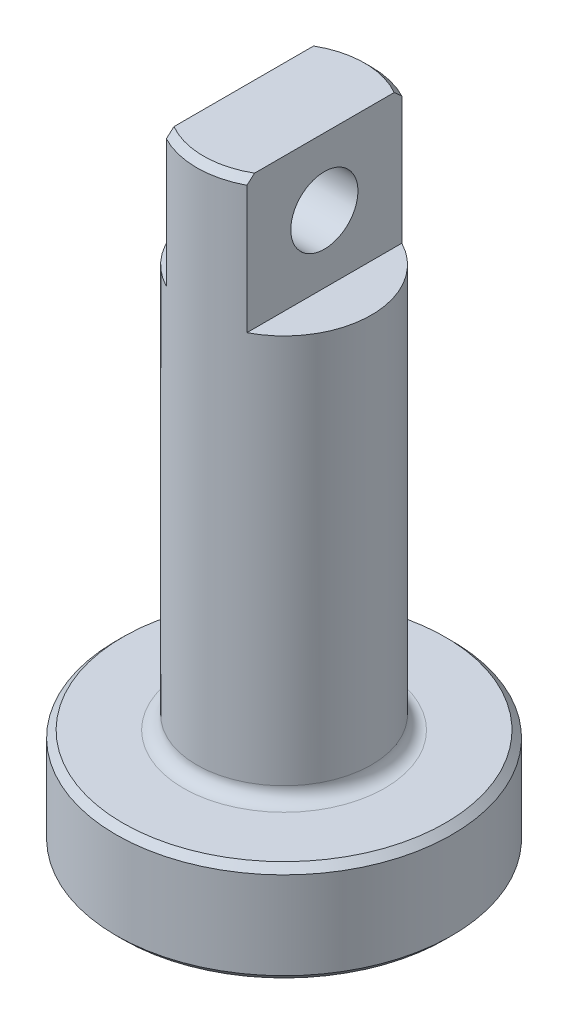
ISO-10303-21;
HEADER;
FILE_DESCRIPTION(('STEP AP214'),'2;1');
FILE_NAME('part.step','',(''),(''),'','','');
FILE_SCHEMA(('AUTOMOTIVE_DESIGN { 1 0 10303 214 1 1 1 1 }'));
ENDSEC;
DATA;
#1=APPLICATION_CONTEXT('core data for automotive mechanical design processes');
#2=APPLICATION_PROTOCOL_DEFINITION('international standard','automotive_design',2000,#1);
#3=PRODUCT_CONTEXT('',#1,'mechanical');
#4=PRODUCT('Part','Part','',(#3));
#5=PRODUCT_RELATED_PRODUCT_CATEGORY('part','',(#4));
#6=PRODUCT_DEFINITION_FORMATION('','',#4);
#7=PRODUCT_DEFINITION_CONTEXT('part definition',#1,'design');
#8=PRODUCT_DEFINITION('design','',#6,#7);
#9=PRODUCT_DEFINITION_SHAPE('','',#8);
#10=(LENGTH_UNIT() NAMED_UNIT(*) SI_UNIT(.MILLI.,.METRE.));
#11=(NAMED_UNIT(*) PLANE_ANGLE_UNIT() SI_UNIT($,.RADIAN.));
#12=(NAMED_UNIT(*) SI_UNIT($,.STERADIAN.) SOLID_ANGLE_UNIT());
#13=UNCERTAINTY_MEASURE_WITH_UNIT(LENGTH_MEASURE(1.E-05),#10,'distance_accuracy_value','');
#14=(GEOMETRIC_REPRESENTATION_CONTEXT(3) GLOBAL_UNCERTAINTY_ASSIGNED_CONTEXT((#13)) GLOBAL_UNIT_ASSIGNED_CONTEXT((#10,
#11,#12)) REPRESENTATION_CONTEXT('',''));
#15=CARTESIAN_POINT('',(0.,0.,0.));
#16=DIRECTION('',(0.,0.,1.));
#17=DIRECTION('',(1.,0.,0.));
#18=AXIS2_PLACEMENT_3D('',#15,#16,#17);
#19=CARTESIAN_POINT('',(0.,95.,0.));
#20=DIRECTION('',(0.,-1.,0.));
#21=DIRECTION('',(0.,0.,-1.));
#22=AXIS2_PLACEMENT_3D('',#19,#20,#21);
#23=CONICAL_SURFACE('',#22,12.,0.785398163397443);
#24=CARTESIAN_POINT('',(-6.,79.9275470546993,26.3991990120062));
#25=CARTESIAN_POINT('',(-6.,80.6341642450559,25.6744988883897));
#26=CARTESIAN_POINT('',(-6.,81.3401092025552,24.9491402545293));
#27=CARTESIAN_POINT('',(-6.,82.7501344284375,23.496538406795));
#28=CARTESIAN_POINT('',(-6.,83.4542145956639,22.7692950947542));
#29=CARTESIAN_POINT('',(-6.,84.8614487395655,21.3108434702345));
#30=CARTESIAN_POINT('',(-6.,85.5645973409479,20.5796299681985));
#31=CARTESIAN_POINT('',(-6.,86.9675119394741,19.1140214225354));
#32=CARTESIAN_POINT('',(-6.,87.6672780823759,18.3796265186355));
#33=CARTESIAN_POINT('',(-6.,88.730253828766,17.2568520242311));
#34=CARTESIAN_POINT('',(-6.,89.0951785539853,16.8700963866775));
#35=CARTESIAN_POINT('',(-6.,89.8234368655577,16.0950904637233));
#36=CARTESIAN_POINT('',(-6.,90.186770455018,15.7068401812442));
#37=CARTESIAN_POINT('',(-6.,90.9115326321244,14.9284606953896));
#38=CARTESIAN_POINT('',(-6.,91.2729609400681,14.5383312313932));
#39=CARTESIAN_POINT('',(-6.,91.9933640619721,13.755816200192));
#40=CARTESIAN_POINT('',(-6.,92.3523388916992,13.3634306475153));
#41=CARTESIAN_POINT('',(-6.,93.0667694779259,12.5762564427714));
#42=CARTESIAN_POINT('',(-6.,93.4222286899368,12.1814709315466));
#43=CARTESIAN_POINT('',(-6.,94.1290810155683,11.388281258454));
#44=CARTESIAN_POINT('',(-6.,94.4804741831645,10.989877144748));
#45=CARTESIAN_POINT('',(-6.,95.1777740838798,10.188434340361));
#46=CARTESIAN_POINT('',(-6.,95.5236820342044,9.78539671312347));
#47=CARTESIAN_POINT('',(-6.,96.0369142189372,9.17611739646055));
#48=CARTESIAN_POINT('',(-6.,96.2070487906753,8.9722427322967));
#49=CARTESIAN_POINT('',(-6.,96.5450749310579,8.56264381811767));
#50=CARTESIAN_POINT('',(-6.,96.7129665311361,8.35691959409061));
#51=CARTESIAN_POINT('',(-6.,97.017598282954,7.97863814383269));
#52=CARTESIAN_POINT('',(-6.,97.1547594096519,7.80642013487587));
#53=CARTESIAN_POINT('',(-6.,97.4269059876114,7.460266432646));
#54=CARTESIAN_POINT('',(-6.,97.5618914025965,7.28633071081072));
#55=CARTESIAN_POINT('',(-6.,97.8293349857229,6.93641358608451));
#56=CARTESIAN_POINT('',(-6.,97.9617921210289,6.7604313925058));
#57=CARTESIAN_POINT('',(-6.,98.2236159497381,6.40618114096575));
#58=CARTESIAN_POINT('',(-6.,98.3529826773984,6.22791310837669));
#59=CARTESIAN_POINT('',(-6.,98.607557873833,5.86932535562481));
#60=CARTESIAN_POINT('',(-6.,98.7327788497951,5.68901453769259));
#61=CARTESIAN_POINT('',(-6.,98.9786988744435,5.32533782315688));
#62=CARTESIAN_POINT('',(-6.,99.0993981427097,5.14197207553109));
#63=CARTESIAN_POINT('',(-6.,99.3351744212622,4.77178257472588));
#64=CARTESIAN_POINT('',(-6.,99.4502543733339,4.58496070306697));
#65=CARTESIAN_POINT('',(-6.,99.6734936513251,4.20724452857542));
#66=CARTESIAN_POINT('',(-6.,99.7816540978106,4.01635089184748));
#67=CARTESIAN_POINT('',(-6.,99.9867346088436,3.63471286364854));
#68=CARTESIAN_POINT('',(-6.,100.083867954794,3.44408384376266));
#69=CARTESIAN_POINT('',(-6.,100.267857618415,3.0578693113396));
#70=CARTESIAN_POINT('',(-6.,100.354713302449,2.86228349410867));
#71=CARTESIAN_POINT('',(-6.,100.515418397594,2.4662661930644));
#72=CARTESIAN_POINT('',(-6.,100.589294994322,2.26584586230924));
#73=CARTESIAN_POINT('',(-6.,100.721286108256,1.85984825952783));
#74=CARTESIAN_POINT('',(-6.,100.77940482658,1.6542723779924));
#75=CARTESIAN_POINT('',(-6.,100.868455839644,1.27430186961261));
#76=CARTESIAN_POINT('',(-6.,100.902340693707,1.10060334302168));
#77=CARTESIAN_POINT('',(-6.,100.95564966851,0.750990039261594));
#78=CARTESIAN_POINT('',(-6.,100.975075907761,0.575075590617254));
#79=CARTESIAN_POINT('',(-6.,100.998449404278,0.222479157799282));
#80=CARTESIAN_POINT('',(-6.,101.002420460355,0.0457987734447481));
#81=CARTESIAN_POINT('',(-6.,100.994732235978,-0.307224471346836));
#82=CARTESIAN_POINT('',(-6.,100.983072270821,-0.483567316659432));
#83=CARTESIAN_POINT('',(-6.,100.944833883917,-0.833797575107952));
#84=CARTESIAN_POINT('',(-6.,100.918322981786,-1.00769247542408));
#85=CARTESIAN_POINT('',(-6.,100.851703997765,-1.35286680042485));
#86=CARTESIAN_POINT('',(-6.,100.81159253599,-1.52414556390357));
#87=CARTESIAN_POINT('',(-6.,100.719306074664,-1.86384642655355));
#88=CARTESIAN_POINT('',(-6.,100.667101067279,-2.03226028235725));
#89=CARTESIAN_POINT('',(-6.,100.552431435734,-2.36550613445244));
#90=CARTESIAN_POINT('',(-6.,100.489967464961,-2.5303383580992));
#91=CARTESIAN_POINT('',(-6.,100.323908681208,-2.93584381032676));
#92=CARTESIAN_POINT('',(-6.,100.215094005153,-3.17437424992507));
#93=CARTESIAN_POINT('',(-6.,99.9829345223585,-3.64430718878424));
#94=CARTESIAN_POINT('',(-6.,99.8595811245706,-3.87570537063528));
#95=CARTESIAN_POINT('',(-6.,99.6015545052451,-4.3327401148906));
#96=CARTESIAN_POINT('',(-6.,99.4668564575361,-4.55836255417597));
#97=CARTESIAN_POINT('',(-6.,99.1889875522021,-5.0042272134799));
#98=CARTESIAN_POINT('',(-6.,99.0458183977673,-5.22447050252756));
#99=CARTESIAN_POINT('',(-6.,98.7507115853472,-5.66370867918485));
#100=CARTESIAN_POINT('',(-6.,98.5986757951483,-5.8826373298122));
#101=CARTESIAN_POINT('',(-6.,98.2892471146105,-6.31667340263283));
#102=CARTESIAN_POINT('',(-6.,98.1318540176332,-6.53178067694256));
#103=CARTESIAN_POINT('',(-6.,97.8130186542161,-6.95849815270591));
#104=CARTESIAN_POINT('',(-6.,97.6515823239706,-7.17011280190461));
#105=CARTESIAN_POINT('',(-6.,97.3252672053643,-7.59065458481818));
#106=CARTESIAN_POINT('',(-6.,97.1603885240668,-7.7995818017913));
#107=CARTESIAN_POINT('',(-6.,96.8222180631181,-8.22215520873711));
#108=CARTESIAN_POINT('',(-6.,96.6488297591678,-8.43572403551774));
#109=CARTESIAN_POINT('',(-6.,96.2995604201917,-8.86081538830492));
#110=CARTESIAN_POINT('',(-6.,96.1236793475583,-9.07233788335791));
#111=CARTESIAN_POINT('',(-6.,95.5929179537855,-9.70433234633449));
#112=CARTESIAN_POINT('',(-6.,95.2349414664821,-10.1222040167637));
#113=CARTESIAN_POINT('',(-6.,94.5130229138458,-10.9529289983091));
#114=CARTESIAN_POINT('',(-6.,94.1490793262811,-11.365780980588));
#115=CARTESIAN_POINT('',(-6.,93.4168217156854,-12.1875964360031));
#116=CARTESIAN_POINT('',(-6.,93.0485076280156,-12.5965598514667));
#117=CARTESIAN_POINT('',(-6.,92.3079835719101,-13.41210401886));
#118=CARTESIAN_POINT('',(-6.,91.9357684225031,-13.8186800589457));
#119=CARTESIAN_POINT('',(-6.,91.1887429979728,-14.6294445721158));
#120=CARTESIAN_POINT('',(-6.,90.8139327029217,-15.0336330268221));
#121=CARTESIAN_POINT('',(-6.,90.062317453639,-15.8400257096986));
#122=CARTESIAN_POINT('',(-6.,89.6855128367611,-16.2422302525411));
#123=CARTESIAN_POINT('',(-6.,88.9302423180558,-17.0450763862343));
#124=CARTESIAN_POINT('',(-6.,88.5517764143453,-17.4457179753124));
#125=CARTESIAN_POINT('',(-6.,87.4906861331165,-18.5651862632157));
#126=CARTESIAN_POINT('',(-6.,86.8065512177971,-19.2825809906635));
#127=CARTESIAN_POINT('',(-6.,85.4351146395958,-20.7143997749292));
#128=CARTESIAN_POINT('',(-6.,84.7478128248482,-21.4288236860923));
#129=CARTESIAN_POINT('',(-6.,83.3726680825579,-22.8535686564425));
#130=CARTESIAN_POINT('',(-6.,82.6848311992118,-23.5638955527008));
#131=CARTESIAN_POINT('',(-6.,81.3073933744064,-24.9827583302249));
#132=CARTESIAN_POINT('',(-6.,80.6177925361713,-25.6912943116774));
#133=CARTESIAN_POINT('',(-6.,79.9275470546993,-26.3991990120062));
#134=B_SPLINE_CURVE_WITH_KNOTS('',3,(#24,#25,#26,#27,#28,#29,#30,#31,#32,#33,#34,#35,#36,#37,
#38,#39,#40,#41,#42,#43,#44,#45,#46,#47,#48,#49,#50,#51,#52,#53,#54,#55,#56,#57,#58,#59,#60,#61,
#62,#63,#64,#65,#66,#67,#68,#69,#70,#71,#72,#73,#74,#75,#76,#77,#78,#79,#80,#81,#82,#83,#84,#85,
#86,#87,#88,#89,#90,#91,#92,#93,#94,#95,#96,#97,#98,#99,#100,#101,#102,#103,#104,#105,#106,#107,
#108,#109,#110,#111,#112,#113,#114,#115,#116,#117,#118,#119,#120,#121,#122,#123,#124,#125,#126,
#127,#128,#129,#130,#131,#132,#133),.UNSPECIFIED.,.F.,.F.,(4,2,2,2,2,2,2,2,2,2,2,2,2,2,2,2,2,2,
2,2,2,2,2,2,2,2,2,2,2,2,2,2,2,2,2,2,2,2,2,2,2,2,2,2,2,2,2,2,2,2,2,2,2,2,4),(0.,3.03652776817247,
6.07321701277391,9.11653393222047,12.1597185174794,13.7549422607052,15.3501628873787,
16.9456115173444,18.5410498848744,20.1347222177439,21.7283733707016,23.3216657885185,
24.1182688353278,24.9148607065292,25.5753384275979,26.2358271496837,26.8965801521601,
27.5573258267736,28.2158522122217,28.8743465772151,29.5324924323901,30.1905314341892,
30.8321338816637,31.4737758644831,32.1140574301531,32.7541681258213,33.2845448339715,
33.8148438147631,34.3443258857864,34.8738311510566,35.4009483401105,35.9281966195861,
36.456767450453,36.9853046300351,37.7711411972683,38.5574444720165,39.3455155445757,
40.1334287034557,40.9329540547798,41.7325102798517,42.5309544535898,43.3293738311877,
44.1546244006187,44.9798874336309,46.6305186231746,48.2815776576077,49.9326611413901,
51.5863201509729,53.2399918728272,54.8933922764112,56.5467945548055,59.5207099325351,
62.4947694374373,65.4611027910469,68.4272663582917),.UNSPECIFIED.);
#135=CARTESIAN_POINT('',(-6.,94.,11.5325625946708));
#136=VERTEX_POINT('',#135);
#137=CARTESIAN_POINT('',(-6.,95.,10.3923048454132));
#138=VERTEX_POINT('',#137);
#139=EDGE_CURVE('E184',#136,#138,#134,.T.);
#140=ORIENTED_EDGE('',*,*,#139,.F.);
#141=CARTESIAN_POINT('',(0.,94.,0.));
#142=DIRECTION('',(0.,1.,0.));
#143=DIRECTION('',(0.,0.,1.));
#144=AXIS2_PLACEMENT_3D('',#141,#142,#143);
#145=CIRCLE('',#144,13.);
#146=CARTESIAN_POINT('',(6.,94.,11.5325625946708));
#147=VERTEX_POINT('',#146);
#148=EDGE_CURVE('E115',#147,#136,#145,.F.);
#149=ORIENTED_EDGE('',*,*,#148,.F.);
#150=CARTESIAN_POINT('',(6.,79.9275470546993,-26.3991990120062));
#151=CARTESIAN_POINT('',(6.,80.6341642450559,-25.6744988883897));
#152=CARTESIAN_POINT('',(6.,81.3401092025552,-24.9491402545293));
#153=CARTESIAN_POINT('',(6.,82.7501344284375,-23.496538406795));
#154=CARTESIAN_POINT('',(6.,83.4542145956639,-22.7692950947542));
#155=CARTESIAN_POINT('',(6.,84.8614487395655,-21.3108434702345));
#156=CARTESIAN_POINT('',(6.,85.5645973409479,-20.5796299681985));
#157=CARTESIAN_POINT('',(6.,86.9675119394741,-19.1140214225354));
#158=CARTESIAN_POINT('',(6.,87.6672780823759,-18.3796265186355));
#159=CARTESIAN_POINT('',(6.,88.730253828766,-17.2568520242311));
#160=CARTESIAN_POINT('',(6.,89.0951785539853,-16.8700963866775));
#161=CARTESIAN_POINT('',(6.,89.8234368655577,-16.0950904637233));
#162=CARTESIAN_POINT('',(6.,90.186770455018,-15.7068401812442));
#163=CARTESIAN_POINT('',(6.,90.9115326321244,-14.9284606953896));
#164=CARTESIAN_POINT('',(6.,91.2729609400681,-14.5383312313932));
#165=CARTESIAN_POINT('',(6.,91.9933640619721,-13.755816200192));
#166=CARTESIAN_POINT('',(6.,92.3523388916992,-13.3634306475154));
#167=CARTESIAN_POINT('',(6.,93.0667694779259,-12.5762564427714));
#168=CARTESIAN_POINT('',(6.,93.4222286899368,-12.1814709315466));
#169=CARTESIAN_POINT('',(6.,94.1290810155683,-11.3882812584541));
#170=CARTESIAN_POINT('',(6.,94.4804741831645,-10.989877144748));
#171=CARTESIAN_POINT('',(6.,95.1777740838798,-10.188434340361));
#172=CARTESIAN_POINT('',(6.,95.5236820342044,-9.78539671312348));
#173=CARTESIAN_POINT('',(6.,96.0369142189372,-9.17611739646056));
#174=CARTESIAN_POINT('',(6.,96.2070487906753,-8.9722427322967));
#175=CARTESIAN_POINT('',(6.,96.5450749310579,-8.56264381811767));
#176=CARTESIAN_POINT('',(6.,96.7129665311361,-8.3569195940906));
#177=CARTESIAN_POINT('',(6.,97.017598282954,-7.97863814383269));
#178=CARTESIAN_POINT('',(6.,97.1547594096519,-7.80642013487588));
#179=CARTESIAN_POINT('',(6.,97.4269059876114,-7.46026643264601));
#180=CARTESIAN_POINT('',(6.,97.5618914025965,-7.28633071081073));
#181=CARTESIAN_POINT('',(6.,97.8293349857229,-6.93641358608452));
#182=CARTESIAN_POINT('',(6.,97.9617921210289,-6.7604313925058));
#183=CARTESIAN_POINT('',(6.,98.2236159497381,-6.40618114096576));
#184=CARTESIAN_POINT('',(6.,98.3529826773984,-6.22791310837669));
#185=CARTESIAN_POINT('',(6.,98.607557873833,-5.8693253556248));
#186=CARTESIAN_POINT('',(6.,98.7327788497951,-5.68901453769259));
#187=CARTESIAN_POINT('',(6.,98.9786988744435,-5.32533782315688));
#188=CARTESIAN_POINT('',(6.,99.0993981427097,-5.14197207553109));
#189=CARTESIAN_POINT('',(6.,99.3351744212622,-4.77178257472588));
#190=CARTESIAN_POINT('',(6.,99.4502543733339,-4.58496070306696));
#191=CARTESIAN_POINT('',(6.,99.6734936513251,-4.20724452857542));
#192=CARTESIAN_POINT('',(6.,99.7816540978106,-4.01635089184748));
#193=CARTESIAN_POINT('',(6.,99.9867346088436,-3.63471286364853));
#194=CARTESIAN_POINT('',(6.,100.083867954794,-3.44408384376266));
#195=CARTESIAN_POINT('',(6.,100.267857618415,-3.0578693113396));
#196=CARTESIAN_POINT('',(6.,100.354713302449,-2.86228349410867));
#197=CARTESIAN_POINT('',(6.,100.515418397594,-2.4662661930644));
#198=CARTESIAN_POINT('',(6.,100.589294994322,-2.26584586230924));
#199=CARTESIAN_POINT('',(6.,100.721286108256,-1.85984825952782));
#200=CARTESIAN_POINT('',(6.,100.77940482658,-1.6542723779924));
#201=CARTESIAN_POINT('',(6.,100.868455839644,-1.2743018696126));
#202=CARTESIAN_POINT('',(6.,100.902340693707,-1.10060334302167));
#203=CARTESIAN_POINT('',(6.,100.95564966851,-0.750990039261589));
#204=CARTESIAN_POINT('',(6.,100.975075907761,-0.575075590617252));
#205=CARTESIAN_POINT('',(6.,100.998449404278,-0.222479157799285));
#206=CARTESIAN_POINT('',(6.,101.002420460355,-0.0457987734447505));
#207=CARTESIAN_POINT('',(6.,100.994732235978,0.307224471346836));
#208=CARTESIAN_POINT('',(6.,100.983072270821,0.483567316659434));
#209=CARTESIAN_POINT('',(6.,100.944833883917,0.833797575107957));
#210=CARTESIAN_POINT('',(6.,100.918322981786,1.00769247542409));
#211=CARTESIAN_POINT('',(6.,100.851703997765,1.35286680042485));
#212=CARTESIAN_POINT('',(6.,100.81159253599,1.52414556390357));
#213=CARTESIAN_POINT('',(6.,100.719306074664,1.86384642655355));
#214=CARTESIAN_POINT('',(6.,100.667101067279,2.03226028235726));
#215=CARTESIAN_POINT('',(6.,100.552431435734,2.36550613445245));
#216=CARTESIAN_POINT('',(6.,100.489967464961,2.5303383580992));
#217=CARTESIAN_POINT('',(6.,100.323908681208,2.93584381032676));
#218=CARTESIAN_POINT('',(6.,100.215094005153,3.17437424992507));
#219=CARTESIAN_POINT('',(6.,99.9829345223585,3.64430718878424));
#220=CARTESIAN_POINT('',(6.,99.8595811245706,3.87570537063528));
#221=CARTESIAN_POINT('',(6.,99.6015545052451,4.3327401148906));
#222=CARTESIAN_POINT('',(6.,99.4668564575361,4.55836255417598));
#223=CARTESIAN_POINT('',(6.,99.1889875522021,5.00422721347991));
#224=CARTESIAN_POINT('',(6.,99.0458183977673,5.22447050252756));
#225=CARTESIAN_POINT('',(6.,98.7507115853472,5.66370867918485));
#226=CARTESIAN_POINT('',(6.,98.5986757951483,5.88263732981221));
#227=CARTESIAN_POINT('',(6.,98.2892471146104,6.31667340263284));
#228=CARTESIAN_POINT('',(6.,98.1318540176332,6.53178067694256));
#229=CARTESIAN_POINT('',(6.,97.8130186542161,6.95849815270591));
#230=CARTESIAN_POINT('',(6.,97.6515823239706,7.17011280190461));
#231=CARTESIAN_POINT('',(6.,97.3252672053643,7.59065458481819));
#232=CARTESIAN_POINT('',(6.,97.1603885240668,7.7995818017913));
#233=CARTESIAN_POINT('',(6.,96.8222180631181,8.22215520873711));
#234=CARTESIAN_POINT('',(6.,96.6488297591678,8.43572403551774));
#235=CARTESIAN_POINT('',(6.,96.2995604201917,8.86081538830492));
#236=CARTESIAN_POINT('',(6.,96.1236793475583,9.07233788335791));
#237=CARTESIAN_POINT('',(6.,95.5929179537855,9.70433234633449));
#238=CARTESIAN_POINT('',(6.,95.2349414664821,10.1222040167637));
#239=CARTESIAN_POINT('',(6.,94.5130229138458,10.9529289983091));
#240=CARTESIAN_POINT('',(6.,94.1490793262811,11.365780980588));
#241=CARTESIAN_POINT('',(6.,93.4168217156854,12.1875964360031));
#242=CARTESIAN_POINT('',(6.,93.0485076280156,12.5965598514667));
#243=CARTESIAN_POINT('',(6.,92.3079835719101,13.41210401886));
#244=CARTESIAN_POINT('',(6.,91.9357684225031,13.8186800589457));
#245=CARTESIAN_POINT('',(6.,91.1887429979728,14.6294445721158));
#246=CARTESIAN_POINT('',(6.,90.8139327029217,15.0336330268221));
#247=CARTESIAN_POINT('',(6.,90.062317453639,15.8400257096987));
#248=CARTESIAN_POINT('',(6.,89.685512836761,16.2422302525411));
#249=CARTESIAN_POINT('',(6.,88.9302423180558,17.0450763862344));
#250=CARTESIAN_POINT('',(6.,88.5517764143452,17.4457179753124));
#251=CARTESIAN_POINT('',(6.,87.4906861331165,18.5651862632157));
#252=CARTESIAN_POINT('',(6.,86.8065512177971,19.2825809906635));
#253=CARTESIAN_POINT('',(6.,85.4351146395958,20.7143997749292));
#254=CARTESIAN_POINT('',(6.,84.7478128248482,21.4288236860923));
#255=CARTESIAN_POINT('',(6.,83.3726680825579,22.8535686564425));
#256=CARTESIAN_POINT('',(6.,82.6848311992118,23.5638955527008));
#257=CARTESIAN_POINT('',(6.,81.3073933744064,24.9827583302249));
#258=CARTESIAN_POINT('',(6.,80.6177925361713,25.6912943116774));
#259=CARTESIAN_POINT('',(6.,79.9275470546993,26.3991990120062));
#260=B_SPLINE_CURVE_WITH_KNOTS('',3,(#150,#151,#152,#153,#154,#155,#156,#157,#158,#159,#160,
#161,#162,#163,#164,#165,#166,#167,#168,#169,#170,#171,#172,#173,#174,#175,#176,#177,#178,#179,
#180,#181,#182,#183,#184,#185,#186,#187,#188,#189,#190,#191,#192,#193,#194,#195,#196,#197,#198,
#199,#200,#201,#202,#203,#204,#205,#206,#207,#208,#209,#210,#211,#212,#213,#214,#215,#216,#217,
#218,#219,#220,#221,#222,#223,#224,#225,#226,#227,#228,#229,#230,#231,#232,#233,#234,#235,#236,
#237,#238,#239,#240,#241,#242,#243,#244,#245,#246,#247,#248,#249,#250,#251,#252,#253,#254,#255,
#256,#257,#258,#259),.UNSPECIFIED.,.F.,.F.,(4,2,2,2,2,2,2,2,2,2,2,2,2,2,2,2,2,2,2,2,2,2,2,2,2,2,
2,2,2,2,2,2,2,2,2,2,2,2,2,2,2,2,2,2,2,2,2,2,2,2,2,2,2,2,4),(0.,3.03652776817249,
6.07321701277394,9.11653393222051,12.1597185174794,13.7549422607052,15.3501628873787,
16.9456115173444,18.5410498848744,20.1347222177439,21.7283733707016,23.3216657885185,
24.1182688353278,24.9148607065292,25.5753384275979,26.2358271496837,26.8965801521601,
27.5573258267736,28.2158522122217,28.8743465772151,29.5324924323901,30.1905314341892,
30.8321338816637,31.4737758644831,32.1140574301531,32.7541681258213,33.2845448339715,
33.8148438147631,34.3443258857864,34.8738311510566,35.4009483401105,35.9281966195861,
36.456767450453,36.9853046300351,37.7711411972683,38.5574444720165,39.3455155445757,
40.1334287034558,40.9329540547798,41.7325102798517,42.5309544535898,43.3293738311877,
44.1546244006187,44.9798874336309,46.6305186231746,48.2815776576077,49.9326611413901,
51.5863201509729,53.2399918728272,54.8933922764112,56.5467945548055,59.5207099325351,
62.4947694374373,65.4611027910469,68.4272663582916),.UNSPECIFIED.);
#261=CARTESIAN_POINT('',(6.,95.,10.3923048454132));
#262=VERTEX_POINT('',#261);
#263=EDGE_CURVE('E102',#262,#147,#260,.T.);
#264=ORIENTED_EDGE('',*,*,#263,.F.);
#265=CARTESIAN_POINT('',(0.,95.,0.));
#266=DIRECTION('',(0.,1.,0.));
#267=DIRECTION('',(0.,0.,1.));
#268=AXIS2_PLACEMENT_3D('',#265,#266,#267);
#269=CIRCLE('',#268,12.);
#270=EDGE_CURVE('E110',#138,#262,#269,.T.);
#271=ORIENTED_EDGE('',*,*,#270,.F.);
#272=EDGE_LOOP('',(#140,#149,#264,#271));
#273=FACE_BOUND('',#272,.T.);
#274=ADVANCED_FACE('F42',(#273),#23,.T.);
#275=CARTESIAN_POINT('',(0.,15.,0.));
#276=DIRECTION('',(0.,-1.,0.));
#277=DIRECTION('',(0.,0.,-1.));
#278=AXIS2_PLACEMENT_3D('',#275,#276,#277);
#279=CONICAL_SURFACE('',#278,24.,0.785398163397448);
#280=CARTESIAN_POINT('',(0.,15.,0.));
#281=DIRECTION('',(0.,1.,0.));
#282=DIRECTION('',(0.,0.,1.));
#283=AXIS2_PLACEMENT_3D('',#280,#281,#282);
#284=CIRCLE('',#283,24.);
#285=CARTESIAN_POINT('',(0.,15.,24.));
#286=VERTEX_POINT('',#285);
#287=EDGE_CURVE('E204',#286,#286,#284,.T.);
#288=ORIENTED_EDGE('',*,*,#287,.F.);
#289=EDGE_LOOP('',(#288));
#290=FACE_BOUND('',#289,.T.);
#291=CARTESIAN_POINT('',(0.,14.,0.));
#292=DIRECTION('',(0.,1.,0.));
#293=DIRECTION('',(0.,0.,1.));
#294=AXIS2_PLACEMENT_3D('',#291,#292,#293);
#295=CIRCLE('',#294,25.);
#296=CARTESIAN_POINT('',(0.,14.,25.));
#297=VERTEX_POINT('',#296);
#298=EDGE_CURVE('E207',#297,#297,#295,.F.);
#299=ORIENTED_EDGE('',*,*,#298,.F.);
#300=EDGE_LOOP('',(#299));
#301=FACE_BOUND('',#300,.T.);
#302=ADVANCED_FACE('F167',(#290,#301),#279,.T.);
#303=CARTESIAN_POINT('',(0.,15.,0.));
#304=DIRECTION('',(0.,-1.,0.));
#305=DIRECTION('',(0.,0.,-1.));
#306=AXIS2_PLACEMENT_3D('',#303,#304,#305);
#307=CYLINDRICAL_SURFACE('',#306,25.);
#308=CARTESIAN_POINT('',(0.,1.00000000000001,0.));
#309=DIRECTION('',(0.,1.,0.));
#310=DIRECTION('',(0.,0.,1.));
#311=AXIS2_PLACEMENT_3D('',#308,#309,#310);
#312=CIRCLE('',#311,25.);
#313=CARTESIAN_POINT('',(0.,1.00000000000001,25.));
#314=VERTEX_POINT('',#313);
#315=EDGE_CURVE('E209',#314,#314,#312,.T.);
#316=ORIENTED_EDGE('',*,*,#315,.T.);
#317=EDGE_LOOP('',(#316));
#318=FACE_BOUND('',#317,.T.);
#319=ORIENTED_EDGE('',*,*,#298,.T.);
#320=EDGE_LOOP('',(#319));
#321=FACE_BOUND('',#320,.T.);
#322=ADVANCED_FACE('F160',(#318,#321),#307,.T.);
#323=CARTESIAN_POINT('',(0.,15.,0.));
#324=DIRECTION('',(0.,1.,0.));
#325=DIRECTION('',(0.,0.,1.));
#326=AXIS2_PLACEMENT_3D('',#323,#324,#325);
#327=PLANE('',#326);
#328=CARTESIAN_POINT('',(0.,15.,0.));
#329=DIRECTION('',(0.,1.,0.));
#330=DIRECTION('',(0.,0.,1.));
#331=AXIS2_PLACEMENT_3D('',#328,#329,#330);
#332=CIRCLE('',#331,15.);
#333=CARTESIAN_POINT('',(0.,15.,15.));
#334=VERTEX_POINT('',#333);
#335=EDGE_CURVE('E127',#334,#334,#332,.F.);
#336=ORIENTED_EDGE('',*,*,#335,.T.);
#337=EDGE_LOOP('',(#336));
#338=FACE_BOUND('',#337,.T.);
#339=ORIENTED_EDGE('',*,*,#287,.T.);
#340=EDGE_LOOP('',(#339));
#341=FACE_BOUND('',#340,.T.);
#342=ADVANCED_FACE('F157',(#338,#341),#327,.T.);
#343=CARTESIAN_POINT('',(0.,0.,0.));
#344=DIRECTION('',(0.,1.,0.));
#345=DIRECTION('',(0.,0.,1.));
#346=AXIS2_PLACEMENT_3D('',#343,#344,#345);
#347=PLANE('',#346);
#348=CARTESIAN_POINT('',(0.,0.,0.));
#349=DIRECTION('',(0.,1.,0.));
#350=DIRECTION('',(0.,0.,1.));
#351=AXIS2_PLACEMENT_3D('',#348,#349,#350);
#352=CIRCLE('',#351,24.);
#353=CARTESIAN_POINT('',(0.,0.,24.));
#354=VERTEX_POINT('',#353);
#355=EDGE_CURVE('E120',#354,#354,#352,.F.);
#356=ORIENTED_EDGE('',*,*,#355,.T.);
#357=EDGE_LOOP('',(#356));
#358=FACE_BOUND('',#357,.T.);
#359=ADVANCED_FACE('F155',(#358),#347,.F.);
#360=CARTESIAN_POINT('',(0.,95.,0.));
#361=DIRECTION('',(0.,-1.,0.));
#362=DIRECTION('',(0.,0.,-1.));
#363=AXIS2_PLACEMENT_3D('',#360,#361,#362);
#364=CYLINDRICAL_SURFACE('',#363,13.);
#365=ORIENTED_EDGE('',*,*,#148,.T.);
#366=DIRECTION('',(0.,-1.,0.));
#367=VECTOR('',#366,1.);
#368=CARTESIAN_POINT('',(-6.,95.,11.5325625946708));
#369=LINE('',#368,#367);
#370=CARTESIAN_POINT('',(-6.,75.,11.5325625946708));
#371=VERTEX_POINT('',#370);
#372=EDGE_CURVE('E189',#136,#371,#369,.T.);
#373=ORIENTED_EDGE('',*,*,#372,.T.);
#374=CARTESIAN_POINT('',(0.,75.,0.));
#375=DIRECTION('',(0.,1.,0.));
#376=DIRECTION('',(0.,0.,1.));
#377=AXIS2_PLACEMENT_3D('',#374,#375,#376);
#378=CIRCLE('',#377,13.);
#379=CARTESIAN_POINT('',(-6.,75.,-11.5325625946708));
#380=VERTEX_POINT('',#379);
#381=EDGE_CURVE('E13',#380,#371,#378,.T.);
#382=ORIENTED_EDGE('',*,*,#381,.F.);
#383=DIRECTION('',(0.,-1.,0.));
#384=VECTOR('',#383,1.);
#385=CARTESIAN_POINT('',(-6.,95.,-11.5325625946708));
#386=LINE('',#385,#384);
#387=CARTESIAN_POINT('',(-6.,94.,-11.5325625946708));
#388=VERTEX_POINT('',#387);
#389=EDGE_CURVE('E195',#380,#388,#386,.F.);
#390=ORIENTED_EDGE('',*,*,#389,.T.);
#391=CARTESIAN_POINT('',(6.,94.,-11.5325625946708));
#392=VERTEX_POINT('',#391);
#393=EDGE_CURVE('E118',#388,#392,#145,.F.);
#394=ORIENTED_EDGE('',*,*,#393,.T.);
#395=DIRECTION('',(0.,-1.,0.));
#396=VECTOR('',#395,1.);
#397=CARTESIAN_POINT('',(6.,95.,-11.5325625946708));
#398=LINE('',#397,#396);
#399=CARTESIAN_POINT('',(6.,75.,-11.5325625946708));
#400=VERTEX_POINT('',#399);
#401=EDGE_CURVE('E96',#392,#400,#398,.T.);
#402=ORIENTED_EDGE('',*,*,#401,.T.);
#403=CARTESIAN_POINT('',(0.,75.,0.));
#404=DIRECTION('',(0.,1.,0.));
#405=DIRECTION('',(0.,0.,1.));
#406=AXIS2_PLACEMENT_3D('',#403,#404,#405);
#407=CIRCLE('',#406,13.);
#408=CARTESIAN_POINT('',(6.,75.,11.5325625946708));
#409=VERTEX_POINT('',#408);
#410=EDGE_CURVE('E50',#409,#400,#407,.T.);
#411=ORIENTED_EDGE('',*,*,#410,.F.);
#412=DIRECTION('',(0.,-1.,0.));
#413=VECTOR('',#412,1.);
#414=CARTESIAN_POINT('',(6.,95.,11.5325625946708));
#415=LINE('',#414,#413);
#416=EDGE_CURVE('E191',#409,#147,#415,.F.);
#417=ORIENTED_EDGE('',*,*,#416,.T.);
#418=EDGE_LOOP('',(#365,#373,#382,#390,#394,#402,#411,#417));
#419=FACE_BOUND('',#418,.T.);
#420=CARTESIAN_POINT('',(0.,17.,0.));
#421=DIRECTION('',(0.,1.,0.));
#422=DIRECTION('',(0.,0.,1.));
#423=AXIS2_PLACEMENT_3D('',#420,#421,#422);
#424=CIRCLE('',#423,13.);
#425=CARTESIAN_POINT('',(0.,17.,13.));
#426=VERTEX_POINT('',#425);
#427=EDGE_CURVE('E124',#426,#426,#424,.T.);
#428=ORIENTED_EDGE('',*,*,#427,.T.);
#429=EDGE_LOOP('',(#428));
#430=FACE_BOUND('',#429,.T.);
#431=ADVANCED_FACE('F152',(#419,#430),#364,.T.);
#432=CARTESIAN_POINT('',(0.,95.,0.));
#433=DIRECTION('',(0.,1.,0.));
#434=DIRECTION('',(0.,0.,1.));
#435=AXIS2_PLACEMENT_3D('',#432,#433,#434);
#436=PLANE('',#435);
#437=DIRECTION('',(0.,0.,-1.));
#438=VECTOR('',#437,1.);
#439=CARTESIAN_POINT('',(-6.,95.,11.9938627476032));
#440=LINE('',#439,#438);
#441=CARTESIAN_POINT('',(-6.,95.,-10.3923048454132));
#442=VERTEX_POINT('',#441);
#443=EDGE_CURVE('E57',#138,#442,#440,.T.);
#444=ORIENTED_EDGE('',*,*,#443,.F.);
#445=ORIENTED_EDGE('',*,*,#270,.T.);
#446=DIRECTION('',(0.,0.,1.));
#447=VECTOR('',#446,1.);
#448=CARTESIAN_POINT('',(6.,95.,-11.9938627476032));
#449=LINE('',#448,#447);
#450=CARTESIAN_POINT('',(6.,95.,-10.3923048454132));
#451=VERTEX_POINT('',#450);
#452=EDGE_CURVE('E65',#451,#262,#449,.T.);
#453=ORIENTED_EDGE('',*,*,#452,.F.);
#454=EDGE_CURVE('E108',#451,#442,#269,.T.);
#455=ORIENTED_EDGE('',*,*,#454,.T.);
#456=EDGE_LOOP('',(#444,#445,#453,#455));
#457=FACE_BOUND('',#456,.T.);
#458=ADVANCED_FACE('F107',(#457),#436,.T.);
#459=CARTESIAN_POINT('',(0.,1.00000000000001,0.));
#460=DIRECTION('',(0.,1.,0.));
#461=DIRECTION('',(0.,0.,1.));
#462=AXIS2_PLACEMENT_3D('',#459,#460,#461);
#463=CONICAL_SURFACE('',#462,25.,0.785398163397452);
#464=ORIENTED_EDGE('',*,*,#355,.F.);
#465=EDGE_LOOP('',(#464));
#466=FACE_BOUND('',#465,.T.);
#467=ORIENTED_EDGE('',*,*,#315,.F.);
#468=EDGE_LOOP('',(#467));
#469=FACE_BOUND('',#468,.T.);
#470=ADVANCED_FACE('F151',(#466,#469),#463,.T.);
#471=EDGE_CURVE('E101',#442,#388,#134,.T.);
#472=ORIENTED_EDGE('',*,*,#471,.F.);
#473=ORIENTED_EDGE('',*,*,#454,.F.);
#474=EDGE_CURVE('E92',#392,#451,#260,.T.);
#475=ORIENTED_EDGE('',*,*,#474,.F.);
#476=ORIENTED_EDGE('',*,*,#393,.F.);
#477=EDGE_LOOP('',(#472,#473,#475,#476));
#478=FACE_BOUND('',#477,.T.);
#479=ADVANCED_FACE('F114',(#478),#23,.T.);
#480=CARTESIAN_POINT('',(0.,17.,0.));
#481=DIRECTION('',(0.,1.,0.));
#482=DIRECTION('',(0.,0.,1.));
#483=AXIS2_PLACEMENT_3D('',#480,#481,#482);
#484=TOROIDAL_SURFACE('',#483,15.,2.);
#485=ORIENTED_EDGE('',*,*,#335,.F.);
#486=EDGE_LOOP('',(#485));
#487=FACE_BOUND('',#486,.T.);
#488=ORIENTED_EDGE('',*,*,#427,.F.);
#489=EDGE_LOOP('',(#488));
#490=FACE_BOUND('',#489,.T.);
#491=ADVANCED_FACE('F44',(#487,#490),#484,.F.);
#492=CARTESIAN_POINT('',(0.,75.,0.));
#493=DIRECTION('',(0.,1.,0.));
#494=DIRECTION('',(0.,0.,1.));
#495=AXIS2_PLACEMENT_3D('',#492,#493,#494);
#496=PLANE('',#495);
#497=ORIENTED_EDGE('',*,*,#410,.T.);
#498=DIRECTION('',(0.,0.,1.));
#499=VECTOR('',#498,1.);
#500=CARTESIAN_POINT('',(6.,75.,-11.9938627476032));
#501=LINE('',#500,#499);
#502=EDGE_CURVE('E111',#400,#409,#501,.T.);
#503=ORIENTED_EDGE('',*,*,#502,.T.);
#504=EDGE_LOOP('',(#497,#503));
#505=FACE_BOUND('',#504,.T.);
#506=ADVANCED_FACE('F147',(#505),#496,.T.);
#507=CARTESIAN_POINT('',(6.,75.,-11.9938627476032));
#508=DIRECTION('',(-1.,0.,0.));
#509=DIRECTION('',(0.,0.,1.));
#510=AXIS2_PLACEMENT_3D('',#507,#508,#509);
#511=PLANE('',#510);
#512=CARTESIAN_POINT('',(6.,85.,0.));
#513=DIRECTION('',(-1.,0.,0.));
#514=DIRECTION('',(0.,0.,1.));
#515=AXIS2_PLACEMENT_3D('',#512,#513,#514);
#516=CIRCLE('',#515,5.);
#517=CARTESIAN_POINT('',(6.,85.,5.00000000000001));
#518=VERTEX_POINT('',#517);
#519=EDGE_CURVE('E112',#518,#518,#516,.T.);
#520=ORIENTED_EDGE('',*,*,#519,.T.);
#521=EDGE_LOOP('',(#520));
#522=FACE_BOUND('',#521,.T.);
#523=ORIENTED_EDGE('',*,*,#474,.T.);
#524=ORIENTED_EDGE('',*,*,#452,.T.);
#525=ORIENTED_EDGE('',*,*,#263,.T.);
#526=ORIENTED_EDGE('',*,*,#416,.F.);
#527=ORIENTED_EDGE('',*,*,#502,.F.);
#528=ORIENTED_EDGE('',*,*,#401,.F.);
#529=EDGE_LOOP('',(#523,#524,#525,#526,#527,#528));
#530=FACE_BOUND('',#529,.T.);
#531=ADVANCED_FACE('F93',(#522,#530),#511,.F.);
#532=CARTESIAN_POINT('',(0.,75.,0.));
#533=DIRECTION('',(0.,1.,0.));
#534=DIRECTION('',(0.,0.,1.));
#535=AXIS2_PLACEMENT_3D('',#532,#533,#534);
#536=PLANE('',#535);
#537=ORIENTED_EDGE('',*,*,#381,.T.);
#538=DIRECTION('',(0.,0.,-1.));
#539=VECTOR('',#538,1.);
#540=CARTESIAN_POINT('',(-6.,75.,11.9938627476032));
#541=LINE('',#540,#539);
#542=EDGE_CURVE('E193',#371,#380,#541,.T.);
#543=ORIENTED_EDGE('',*,*,#542,.T.);
#544=EDGE_LOOP('',(#537,#543));
#545=FACE_BOUND('',#544,.T.);
#546=ADVANCED_FACE('F146',(#545),#536,.T.);
#547=CARTESIAN_POINT('',(-6.,75.,11.9938627476032));
#548=DIRECTION('',(1.,0.,0.));
#549=DIRECTION('',(0.,0.,-1.));
#550=AXIS2_PLACEMENT_3D('',#547,#548,#549);
#551=PLANE('',#550);
#552=CARTESIAN_POINT('',(-6.,85.,0.));
#553=DIRECTION('',(-1.,0.,0.));
#554=DIRECTION('',(0.,0.,1.));
#555=AXIS2_PLACEMENT_3D('',#552,#553,#554);
#556=CIRCLE('',#555,5.);
#557=CARTESIAN_POINT('',(-6.,85.,5.00000000000001));
#558=VERTEX_POINT('',#557);
#559=EDGE_CURVE('E239',#558,#558,#556,.T.);
#560=ORIENTED_EDGE('',*,*,#559,.F.);
#561=EDGE_LOOP('',(#560));
#562=FACE_BOUND('',#561,.T.);
#563=ORIENTED_EDGE('',*,*,#139,.T.);
#564=ORIENTED_EDGE('',*,*,#443,.T.);
#565=ORIENTED_EDGE('',*,*,#471,.T.);
#566=ORIENTED_EDGE('',*,*,#389,.F.);
#567=ORIENTED_EDGE('',*,*,#542,.F.);
#568=ORIENTED_EDGE('',*,*,#372,.F.);
#569=EDGE_LOOP('',(#563,#564,#565,#566,#567,#568));
#570=FACE_BOUND('',#569,.T.);
#571=ADVANCED_FACE('F219',(#562,#570),#551,.F.);
#572=CARTESIAN_POINT('',(6.,85.,0.));
#573=DIRECTION('',(-1.,0.,0.));
#574=DIRECTION('',(0.,0.,1.));
#575=AXIS2_PLACEMENT_3D('',#572,#573,#574);
#576=CYLINDRICAL_SURFACE('',#575,5.);
#577=ORIENTED_EDGE('',*,*,#519,.F.);
#578=EDGE_LOOP('',(#577));
#579=FACE_BOUND('',#578,.T.);
#580=ORIENTED_EDGE('',*,*,#559,.T.);
#581=EDGE_LOOP('',(#580));
#582=FACE_BOUND('',#581,.T.);
#583=ADVANCED_FACE('F226',(#579,#582),#576,.F.);
#584=CLOSED_SHELL('',(#274,#302,#322,#342,#359,#431,#458,#470,#479,#491,#506,#531,#546,#571,#583));
#585=MANIFOLD_SOLID_BREP('B2',#584);
#586=ADVANCED_BREP_SHAPE_REPRESENTATION('',(#18,#585),#14);
#587=SHAPE_DEFINITION_REPRESENTATION(#9,#586);
ENDSEC;
END-ISO-10303-21;
